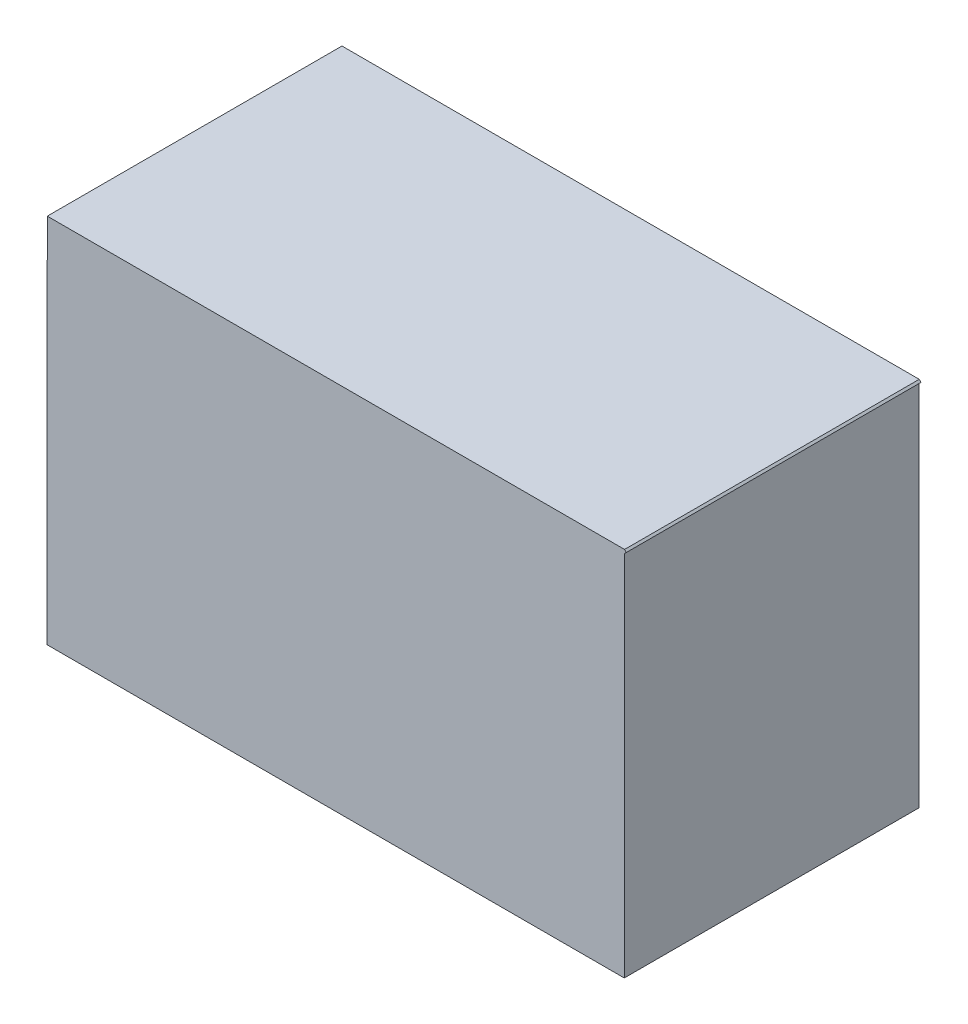
ISO-10303-21;
HEADER;
FILE_DESCRIPTION(('STEP AP214'),'2;1');
FILE_NAME('part.step','',(''),(''),'','','');
FILE_SCHEMA(('AUTOMOTIVE_DESIGN { 1 0 10303 214 1 1 1 1 }'));
ENDSEC;
DATA;
#1=APPLICATION_CONTEXT('core data for automotive mechanical design processes');
#2=APPLICATION_PROTOCOL_DEFINITION('international standard','automotive_design',2000,#1);
#3=PRODUCT_CONTEXT('',#1,'mechanical');
#4=PRODUCT('Part','Part','',(#3));
#5=PRODUCT_RELATED_PRODUCT_CATEGORY('part','',(#4));
#6=PRODUCT_DEFINITION_FORMATION('','',#4);
#7=PRODUCT_DEFINITION_CONTEXT('part definition',#1,'design');
#8=PRODUCT_DEFINITION('design','',#6,#7);
#9=PRODUCT_DEFINITION_SHAPE('','',#8);
#10=(LENGTH_UNIT() NAMED_UNIT(*) SI_UNIT(.MILLI.,.METRE.));
#11=(NAMED_UNIT(*) PLANE_ANGLE_UNIT() SI_UNIT($,.RADIAN.));
#12=(NAMED_UNIT(*) SI_UNIT($,.STERADIAN.) SOLID_ANGLE_UNIT());
#13=UNCERTAINTY_MEASURE_WITH_UNIT(LENGTH_MEASURE(1.E-05),#10,'distance_accuracy_value','');
#14=(GEOMETRIC_REPRESENTATION_CONTEXT(3) GLOBAL_UNCERTAINTY_ASSIGNED_CONTEXT((#13)) GLOBAL_UNIT_ASSIGNED_CONTEXT((#10,
#11,#12)) REPRESENTATION_CONTEXT('',''));
#15=CARTESIAN_POINT('',(0.,0.,0.));
#16=DIRECTION('',(0.,0.,1.));
#17=DIRECTION('',(1.,0.,0.));
#18=AXIS2_PLACEMENT_3D('',#15,#16,#17);
#19=CARTESIAN_POINT('',(-0.98199956,0.63049912,1.));
#20=DIRECTION('',(0.,0.,1.));
#21=DIRECTION('',(1.,0.,0.));
#22=AXIS2_PLACEMENT_3D('',#19,#20,#21);
#23=PLANE('',#22);
#24=DIRECTION('',(-0.707106781186548,0.707106781186548,0.));
#25=VECTOR('',#24,1.);
#26=CARTESIAN_POINT('',(0.97700084,0.63049912,1.));
#27=LINE('',#26,#25);
#28=CARTESIAN_POINT('',(0.97700084,0.63049912,1.));
#29=VERTEX_POINT('',#28);
#30=CARTESIAN_POINT('',(0.98300032,0.62449964,1.));
#31=VERTEX_POINT('',#30);
#32=EDGE_CURVE('E127',#29,#31,#27,.F.);
#33=ORIENTED_EDGE('',*,*,#32,.F.);
#34=DIRECTION('',(1.,0.,0.));
#35=VECTOR('',#34,1.);
#36=CARTESIAN_POINT('',(-0.98199956,0.63049912,1.));
#37=LINE('',#36,#35);
#38=CARTESIAN_POINT('',(-0.98199956,0.63049912,1.));
#39=VERTEX_POINT('',#38);
#40=EDGE_CURVE('E88',#39,#29,#37,.T.);
#41=ORIENTED_EDGE('',*,*,#40,.F.);
#42=DIRECTION('',(-0.000791610690300365,-0.999999686676208,0.));
#43=VECTOR('',#42,1.);
#44=CARTESIAN_POINT('',(-0.98299778,-0.63049912,1.));
#45=LINE('',#44,#43);
#46=CARTESIAN_POINT('',(-0.98299778,-0.63049912,1.));
#47=VERTEX_POINT('',#46);
#48=EDGE_CURVE('E85',#47,#39,#45,.F.);
#49=ORIENTED_EDGE('',*,*,#48,.F.);
#50=DIRECTION('',(0.707106781186548,0.707106781186548,0.));
#51=VECTOR('',#50,1.);
#52=CARTESIAN_POINT('',(-0.98199956,-0.6295009,1.));
#53=LINE('',#52,#51);
#54=CARTESIAN_POINT('',(-0.98199956,-0.6295009,1.));
#55=VERTEX_POINT('',#54);
#56=EDGE_CURVE('E20',#55,#47,#53,.F.);
#57=ORIENTED_EDGE('',*,*,#56,.F.);
#58=DIRECTION('',(1.,0.,0.));
#59=VECTOR('',#58,1.);
#60=CARTESIAN_POINT('',(0.97600008,-0.6295009,1.));
#61=LINE('',#60,#59);
#62=CARTESIAN_POINT('',(0.97600008,-0.6295009,1.));
#63=VERTEX_POINT('',#62);
#64=EDGE_CURVE('E72',#63,#55,#61,.F.);
#65=ORIENTED_EDGE('',*,*,#64,.F.);
#66=DIRECTION('',(0.,1.,0.));
#67=VECTOR('',#66,1.);
#68=CARTESIAN_POINT('',(0.97600008,0.6174994,1.));
#69=LINE('',#68,#67);
#70=CARTESIAN_POINT('',(0.97600008,0.6174994,1.));
#71=VERTEX_POINT('',#70);
#72=EDGE_CURVE('E116',#71,#63,#69,.F.);
#73=ORIENTED_EDGE('',*,*,#72,.F.);
#74=DIRECTION('',(0.707106781186548,0.707106781186548,0.));
#75=VECTOR('',#74,1.);
#76=CARTESIAN_POINT('',(0.98300032,0.62449964,1.));
#77=LINE('',#76,#75);
#78=EDGE_CURVE('E121',#31,#71,#77,.F.);
#79=ORIENTED_EDGE('',*,*,#78,.F.);
#80=EDGE_LOOP('',(#33,#41,#49,#57,#65,#73,#79));
#81=FACE_BOUND('',#80,.T.);
#82=ADVANCED_FACE('F17',(#81),#23,.T.);
#83=CARTESIAN_POINT('',(-0.98299778,-0.63049912,0.));
#84=DIRECTION('',(-0.999999686676208,0.000791610690300365,0.));
#85=DIRECTION('',(-0.000791610690300365,-0.999999686676208,0.));
#86=AXIS2_PLACEMENT_3D('',#83,#84,#85);
#87=PLANE('',#86);
#88=DIRECTION('',(0.,0.,1.));
#89=VECTOR('',#88,1.);
#90=CARTESIAN_POINT('',(-0.98199956,0.63049912,0.));
#91=LINE('',#90,#89);
#92=CARTESIAN_POINT('',(-0.98199956,0.63049912,0.));
#93=VERTEX_POINT('',#92);
#94=EDGE_CURVE('E102',#93,#39,#91,.T.);
#95=ORIENTED_EDGE('',*,*,#94,.F.);
#96=DIRECTION('',(-0.000791610690300419,-0.999999686676208,0.));
#97=VECTOR('',#96,1.);
#98=CARTESIAN_POINT('',(-0.98199956,0.63049912,0.));
#99=LINE('',#98,#97);
#100=CARTESIAN_POINT('',(-0.98299778,-0.63049912,0.));
#101=VERTEX_POINT('',#100);
#102=EDGE_CURVE('E95',#93,#101,#99,.T.);
#103=ORIENTED_EDGE('',*,*,#102,.T.);
#104=DIRECTION('',(0.,0.,1.));
#105=VECTOR('',#104,1.);
#106=CARTESIAN_POINT('',(-0.98299778,-0.63049912,0.));
#107=LINE('',#106,#105);
#108=EDGE_CURVE('E81',#47,#101,#107,.F.);
#109=ORIENTED_EDGE('',*,*,#108,.F.);
#110=ORIENTED_EDGE('',*,*,#48,.T.);
#111=EDGE_LOOP('',(#95,#103,#109,#110));
#112=FACE_BOUND('',#111,.T.);
#113=ADVANCED_FACE('F94',(#112),#87,.T.);
#114=CARTESIAN_POINT('',(-0.98199956,-0.6295009,0.));
#115=DIRECTION('',(0.707106781186548,-0.707106781186548,0.));
#116=DIRECTION('',(0.707106781186548,0.707106781186548,0.));
#117=AXIS2_PLACEMENT_3D('',#114,#115,#116);
#118=PLANE('',#117);
#119=ORIENTED_EDGE('',*,*,#108,.T.);
#120=DIRECTION('',(0.707106781186548,0.707106781186548,0.));
#121=VECTOR('',#120,1.);
#122=CARTESIAN_POINT('',(-0.98199956,-0.6295009,0.));
#123=LINE('',#122,#121);
#124=CARTESIAN_POINT('',(-0.98199956,-0.6295009,0.));
#125=VERTEX_POINT('',#124);
#126=EDGE_CURVE('E129',#101,#125,#123,.T.);
#127=ORIENTED_EDGE('',*,*,#126,.T.);
#128=DIRECTION('',(0.,0.,-1.));
#129=VECTOR('',#128,1.);
#130=CARTESIAN_POINT('',(-0.98199956,-0.6295009,0.));
#131=LINE('',#130,#129);
#132=EDGE_CURVE('E83',#55,#125,#131,.T.);
#133=ORIENTED_EDGE('',*,*,#132,.F.);
#134=ORIENTED_EDGE('',*,*,#56,.T.);
#135=EDGE_LOOP('',(#119,#127,#133,#134));
#136=FACE_BOUND('',#135,.T.);
#137=ADVANCED_FACE('F78',(#136),#118,.T.);
#138=CARTESIAN_POINT('',(0.97600008,-0.6295009,0.));
#139=DIRECTION('',(0.,-1.,0.));
#140=DIRECTION('',(0.,0.,-1.));
#141=AXIS2_PLACEMENT_3D('',#138,#139,#140);
#142=PLANE('',#141);
#143=ORIENTED_EDGE('',*,*,#132,.T.);
#144=DIRECTION('',(1.,0.,0.));
#145=VECTOR('',#144,1.);
#146=CARTESIAN_POINT('',(-0.98199956,-0.6295009,0.));
#147=LINE('',#146,#145);
#148=CARTESIAN_POINT('',(0.97600008,-0.6295009,0.));
#149=VERTEX_POINT('',#148);
#150=EDGE_CURVE('E130',#125,#149,#147,.T.);
#151=ORIENTED_EDGE('',*,*,#150,.T.);
#152=DIRECTION('',(0.,0.,-1.));
#153=VECTOR('',#152,1.);
#154=CARTESIAN_POINT('',(0.97600008,-0.6295009,0.));
#155=LINE('',#154,#153);
#156=EDGE_CURVE('E118',#63,#149,#155,.T.);
#157=ORIENTED_EDGE('',*,*,#156,.F.);
#158=ORIENTED_EDGE('',*,*,#64,.T.);
#159=EDGE_LOOP('',(#143,#151,#157,#158));
#160=FACE_BOUND('',#159,.T.);
#161=ADVANCED_FACE('F159',(#160),#142,.T.);
#162=CARTESIAN_POINT('',(0.97600008,0.6174994,0.));
#163=DIRECTION('',(1.,0.,0.));
#164=DIRECTION('',(0.,0.,-1.));
#165=AXIS2_PLACEMENT_3D('',#162,#163,#164);
#166=PLANE('',#165);
#167=ORIENTED_EDGE('',*,*,#156,.T.);
#168=DIRECTION('',(0.,1.,0.));
#169=VECTOR('',#168,1.);
#170=CARTESIAN_POINT('',(0.97600008,0.63049912,0.));
#171=LINE('',#170,#169);
#172=CARTESIAN_POINT('',(0.97600008,0.6174994,0.));
#173=VERTEX_POINT('',#172);
#174=EDGE_CURVE('E132',#149,#173,#171,.T.);
#175=ORIENTED_EDGE('',*,*,#174,.T.);
#176=DIRECTION('',(0.,0.,1.));
#177=VECTOR('',#176,1.);
#178=CARTESIAN_POINT('',(0.97600008,0.6174994,0.));
#179=LINE('',#178,#177);
#180=EDGE_CURVE('E123',#71,#173,#179,.F.);
#181=ORIENTED_EDGE('',*,*,#180,.F.);
#182=ORIENTED_EDGE('',*,*,#72,.T.);
#183=EDGE_LOOP('',(#167,#175,#181,#182));
#184=FACE_BOUND('',#183,.T.);
#185=ADVANCED_FACE('F150',(#184),#166,.T.);
#186=CARTESIAN_POINT('',(0.98300032,0.62449964,0.));
#187=DIRECTION('',(0.707106781186548,-0.707106781186548,0.));
#188=DIRECTION('',(0.707106781186548,0.707106781186548,0.));
#189=AXIS2_PLACEMENT_3D('',#186,#187,#188);
#190=PLANE('',#189);
#191=ORIENTED_EDGE('',*,*,#180,.T.);
#192=DIRECTION('',(0.707106781186542,0.707106781186553,0.));
#193=VECTOR('',#192,1.);
#194=CARTESIAN_POINT('',(0.97600008,0.6174994,0.));
#195=LINE('',#194,#193);
#196=CARTESIAN_POINT('',(0.98300032,0.62449964,0.));
#197=VERTEX_POINT('',#196);
#198=EDGE_CURVE('E146',#173,#197,#195,.T.);
#199=ORIENTED_EDGE('',*,*,#198,.T.);
#200=DIRECTION('',(0.,0.,1.));
#201=VECTOR('',#200,1.);
#202=CARTESIAN_POINT('',(0.98300032,0.62449964,0.));
#203=LINE('',#202,#201);
#204=EDGE_CURVE('E104',#31,#197,#203,.F.);
#205=ORIENTED_EDGE('',*,*,#204,.F.);
#206=ORIENTED_EDGE('',*,*,#78,.T.);
#207=EDGE_LOOP('',(#191,#199,#205,#206));
#208=FACE_BOUND('',#207,.T.);
#209=ADVANCED_FACE('F167',(#208),#190,.T.);
#210=CARTESIAN_POINT('',(0.97700084,0.63049912,0.));
#211=DIRECTION('',(0.707106781186548,0.707106781186548,0.));
#212=DIRECTION('',(-0.707106781186548,0.707106781186548,0.));
#213=AXIS2_PLACEMENT_3D('',#210,#211,#212);
#214=PLANE('',#213);
#215=ORIENTED_EDGE('',*,*,#204,.T.);
#216=DIRECTION('',(-0.707106781186567,0.707106781186528,0.));
#217=VECTOR('',#216,1.);
#218=CARTESIAN_POINT('',(0.98300032,0.62449964,0.));
#219=LINE('',#218,#217);
#220=CARTESIAN_POINT('',(0.97700084,0.63049912,0.));
#221=VERTEX_POINT('',#220);
#222=EDGE_CURVE('E26',#197,#221,#219,.T.);
#223=ORIENTED_EDGE('',*,*,#222,.T.);
#224=DIRECTION('',(0.,0.,1.));
#225=VECTOR('',#224,1.);
#226=CARTESIAN_POINT('',(0.97700084,0.63049912,0.));
#227=LINE('',#226,#225);
#228=EDGE_CURVE('E34',#29,#221,#227,.F.);
#229=ORIENTED_EDGE('',*,*,#228,.F.);
#230=ORIENTED_EDGE('',*,*,#32,.T.);
#231=EDGE_LOOP('',(#215,#223,#229,#230));
#232=FACE_BOUND('',#231,.T.);
#233=ADVANCED_FACE('F176',(#232),#214,.T.);
#234=CARTESIAN_POINT('',(-0.98199956,0.63049912,0.));
#235=DIRECTION('',(0.,1.,0.));
#236=DIRECTION('',(0.,0.,1.));
#237=AXIS2_PLACEMENT_3D('',#234,#235,#236);
#238=PLANE('',#237);
#239=ORIENTED_EDGE('',*,*,#228,.T.);
#240=DIRECTION('',(1.,0.,0.));
#241=VECTOR('',#240,1.);
#242=CARTESIAN_POINT('',(-0.98199956,0.63049912,0.));
#243=LINE('',#242,#241);
#244=EDGE_CURVE('E11',#221,#93,#243,.F.);
#245=ORIENTED_EDGE('',*,*,#244,.T.);
#246=ORIENTED_EDGE('',*,*,#94,.T.);
#247=ORIENTED_EDGE('',*,*,#40,.T.);
#248=EDGE_LOOP('',(#239,#245,#246,#247));
#249=FACE_BOUND('',#248,.T.);
#250=ADVANCED_FACE('F171',(#249),#238,.T.);
#251=CARTESIAN_POINT('',(-0.98199956,0.63049912,0.));
#252=DIRECTION('',(0.,0.,1.));
#253=DIRECTION('',(1.,0.,0.));
#254=AXIS2_PLACEMENT_3D('',#251,#252,#253);
#255=PLANE('',#254);
#256=ORIENTED_EDGE('',*,*,#222,.F.);
#257=ORIENTED_EDGE('',*,*,#198,.F.);
#258=ORIENTED_EDGE('',*,*,#174,.F.);
#259=ORIENTED_EDGE('',*,*,#150,.F.);
#260=ORIENTED_EDGE('',*,*,#126,.F.);
#261=ORIENTED_EDGE('',*,*,#102,.F.);
#262=ORIENTED_EDGE('',*,*,#244,.F.);
#263=EDGE_LOOP('',(#256,#257,#258,#259,#260,#261,#262));
#264=FACE_BOUND('',#263,.T.);
#265=ADVANCED_FACE('F157',(#264),#255,.F.);
#266=CLOSED_SHELL('',(#82,#113,#137,#161,#185,#209,#233,#250,#265));
#267=MANIFOLD_SOLID_BREP('B1',#266);
#268=ADVANCED_BREP_SHAPE_REPRESENTATION('',(#18,#267),#14);
#269=SHAPE_DEFINITION_REPRESENTATION(#9,#268);
ENDSEC;
END-ISO-10303-21;
